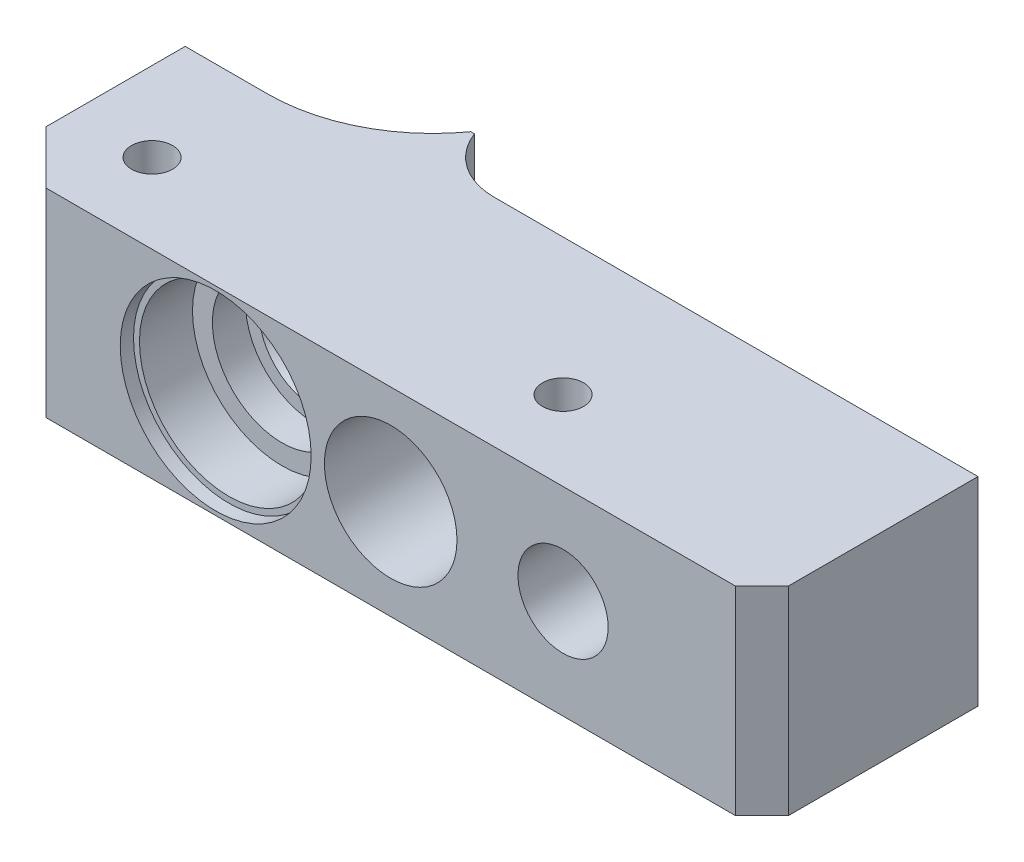
ISO-10303-21;
HEADER;
FILE_DESCRIPTION(('STEP AP214'),'2;1');
FILE_NAME('part.step','',(''),(''),'','','');
FILE_SCHEMA(('AUTOMOTIVE_DESIGN { 1 0 10303 214 1 1 1 1 }'));
ENDSEC;
DATA;
#1=APPLICATION_CONTEXT('core data for automotive mechanical design processes');
#2=APPLICATION_PROTOCOL_DEFINITION('international standard','automotive_design',2000,#1);
#3=PRODUCT_CONTEXT('',#1,'mechanical');
#4=PRODUCT('Part','Part','',(#3));
#5=PRODUCT_RELATED_PRODUCT_CATEGORY('part','',(#4));
#6=PRODUCT_DEFINITION_FORMATION('','',#4);
#7=PRODUCT_DEFINITION_CONTEXT('part definition',#1,'design');
#8=PRODUCT_DEFINITION('design','',#6,#7);
#9=PRODUCT_DEFINITION_SHAPE('','',#8);
#10=(LENGTH_UNIT() NAMED_UNIT(*) SI_UNIT(.MILLI.,.METRE.));
#11=(NAMED_UNIT(*) PLANE_ANGLE_UNIT() SI_UNIT($,.RADIAN.));
#12=(NAMED_UNIT(*) SI_UNIT($,.STERADIAN.) SOLID_ANGLE_UNIT());
#13=UNCERTAINTY_MEASURE_WITH_UNIT(LENGTH_MEASURE(1.E-05),#10,'distance_accuracy_value','');
#14=(GEOMETRIC_REPRESENTATION_CONTEXT(3) GLOBAL_UNCERTAINTY_ASSIGNED_CONTEXT((#13)) GLOBAL_UNIT_ASSIGNED_CONTEXT((#10,
#11,#12)) REPRESENTATION_CONTEXT('',''));
#15=CARTESIAN_POINT('',(0.,0.,0.));
#16=DIRECTION('',(0.,0.,1.));
#17=DIRECTION('',(1.,0.,0.));
#18=AXIS2_PLACEMENT_3D('',#15,#16,#17);
#19=CARTESIAN_POINT('',(-20.2,7.5,1.));
#20=DIRECTION('',(0.,0.,1.));
#21=DIRECTION('',(1.,0.,0.));
#22=AXIS2_PLACEMENT_3D('',#19,#20,#21);
#23=CYLINDRICAL_SURFACE('',#22,6.75);
#24=CARTESIAN_POINT('',(-20.2,7.5,1.));
#25=DIRECTION('',(0.,0.,1.));
#26=DIRECTION('',(1.,0.,0.));
#27=AXIS2_PLACEMENT_3D('',#24,#25,#26);
#28=CIRCLE('',#27,6.75);
#29=CARTESIAN_POINT('',(-13.45,7.5,1.));
#30=VERTEX_POINT('',#29);
#31=EDGE_CURVE('E292',#30,#30,#28,.T.);
#32=ORIENTED_EDGE('',*,*,#31,.F.);
#33=EDGE_LOOP('',(#32));
#34=FACE_BOUND('',#33,.T.);
#35=CARTESIAN_POINT('',(-20.2,7.5,5.));
#36=DIRECTION('',(0.,0.,1.));
#37=DIRECTION('',(1.,0.,0.));
#38=AXIS2_PLACEMENT_3D('',#35,#36,#37);
#39=CIRCLE('',#38,6.75);
#40=CARTESIAN_POINT('',(-13.45,7.5,5.));
#41=VERTEX_POINT('',#40);
#42=EDGE_CURVE('E91',#41,#41,#39,.F.);
#43=ORIENTED_EDGE('',*,*,#42,.F.);
#44=EDGE_LOOP('',(#43));
#45=FACE_BOUND('',#44,.T.);
#46=ADVANCED_FACE('F87',(#34,#45),#23,.F.);
#47=CARTESIAN_POINT('',(-20.2,7.5,-13.7));
#48=DIRECTION('',(0.,0.,1.));
#49=DIRECTION('',(1.,0.,0.));
#50=AXIS2_PLACEMENT_3D('',#47,#48,#49);
#51=CYLINDRICAL_SURFACE('',#50,2.);
#52=CARTESIAN_POINT('',(-20.2,7.5,-13.7));
#53=DIRECTION('',(0.,0.,1.));
#54=DIRECTION('',(1.,0.,0.));
#55=AXIS2_PLACEMENT_3D('',#52,#53,#54);
#56=CIRCLE('',#55,2.);
#57=CARTESIAN_POINT('',(-20.3785243670602,9.49201632783614,-13.7));
#58=VERTEX_POINT('',#57);
#59=CARTESIAN_POINT('',(-20.6530792848273,9.44800389159271,-13.7));
#60=VERTEX_POINT('',#59);
#61=EDGE_CURVE('E182',#58,#60,#56,.T.);
#62=ORIENTED_EDGE('',*,*,#61,.F.);
#63=CARTESIAN_POINT('',(-20.3785243670602,5.50798367216387,-13.7));
#64=CARTESIAN_POINT('',(-20.3562339665487,5.50598857259146,-13.639587014901));
#65=CARTESIAN_POINT('',(-20.332820429799,5.50426458071458,-13.5795852025534));
#66=CARTESIAN_POINT('',(-20.2837703921571,5.50160367173026,-13.4604677064122));
#67=CARTESIAN_POINT('',(-20.2581335023742,5.50066689262328,-13.4013521797699));
#68=CARTESIAN_POINT('',(-20.1777495380695,5.49940284539304,-13.2250553421974));
#69=CARTESIAN_POINT('',(-20.1196842480099,5.50063914822753,-13.1093442471664));
#70=CARTESIAN_POINT('',(-19.9942930428869,5.50959997922952,-12.881122720031));
#71=CARTESIAN_POINT('',(-19.9268467313035,5.517416903225,-12.7686815850578));
#72=CARTESIAN_POINT('',(-19.7842722756689,5.54234922035615,-12.5500856479677));
#73=CARTESIAN_POINT('',(-19.7091587023912,5.5594472334149,-12.4439195058642));
#74=CARTESIAN_POINT('',(-19.5478242950961,5.60733784578206,-12.2329254952434));
#75=CARTESIAN_POINT('',(-19.4612066626561,5.63889491447891,-12.1285653953106));
#76=CARTESIAN_POINT('',(-19.2841775081491,5.71936827884922,-11.9310437631113));
#77=CARTESIAN_POINT('',(-19.1937879504932,5.76819385257937,-11.8378270485851));
#78=CARTESIAN_POINT('',(-19.0275221034974,5.87716894917837,-11.6779868117538));
#79=CARTESIAN_POINT('',(-18.9515630719028,5.93439963428499,-11.6094800682182));
#80=CARTESIAN_POINT('',(-18.8038905224159,6.06453817201612,-11.4833177255646));
#81=CARTESIAN_POINT('',(-18.7321793637566,6.13745463418153,-11.4256681183861));
#82=CARTESIAN_POINT('',(-18.5971759432604,6.2991215773494,-11.3221041781254));
#83=CARTESIAN_POINT('',(-18.533943880843,6.38797578105395,-11.2762718241402));
#84=CARTESIAN_POINT('',(-18.4211708969462,6.57910369995304,-11.1974975938188));
#85=CARTESIAN_POINT('',(-18.3716216428973,6.68136919170932,-11.1645478671011));
#86=CARTESIAN_POINT('',(-18.2951951045445,6.88212552234289,-11.1149462119414));
#87=CARTESIAN_POINT('',(-18.2662407237146,6.97945302596012,-11.0967583169727));
#88=CARTESIAN_POINT('',(-18.2233633106406,7.1786423466987,-11.070108175831));
#89=CARTESIAN_POINT('',(-18.2094349793554,7.28050255212733,-11.0616425009814));
#90=CARTESIAN_POINT('',(-18.1977516669426,7.4797621506277,-11.0545332457909));
#91=CARTESIAN_POINT('',(-18.1991395728632,7.5770942402187,-11.0553691613861));
#92=CARTESIAN_POINT('',(-18.2159539785249,7.77006652583535,-11.0656240333755));
#93=CARTESIAN_POINT('',(-18.231378089697,7.86570700690253,-11.0750415294254));
#94=CARTESIAN_POINT('',(-18.2752893682829,8.05187797781074,-11.102452382365));
#95=CARTESIAN_POINT('',(-18.3036781490159,8.14244128722157,-11.1203811881517));
#96=CARTESIAN_POINT('',(-18.3720000744821,8.31681444948167,-11.1648797599333));
#97=CARTESIAN_POINT('',(-18.4119328643036,8.40062450985322,-11.1914492602797));
#98=CARTESIAN_POINT('',(-18.5023090772933,8.56138855470756,-11.2539178892886));
#99=CARTESIAN_POINT('',(-18.5529748600506,8.6381383604589,-11.2900191704708));
#100=CARTESIAN_POINT('',(-18.661578019386,8.78114389928999,-11.3709561552003));
#101=CARTESIAN_POINT('',(-18.7195177061625,8.84739628318991,-11.4157946361991));
#102=CARTESIAN_POINT('',(-18.8445106712633,8.97347389087995,-11.5173865968942));
#103=CARTESIAN_POINT('',(-18.9119221302739,9.03241481118798,-11.5747906576935));
#104=CARTESIAN_POINT('',(-19.048723322958,9.13768761590182,-11.6980226027821));
#105=CARTESIAN_POINT('',(-19.1181127596007,9.18402138260512,-11.7638492273893));
#106=CARTESIAN_POINT('',(-19.2393664401975,9.25523555219102,-11.8857726990475));
#107=CARTESIAN_POINT('',(-19.2913726528151,9.28259183412261,-11.9403204345301));
#108=CARTESIAN_POINT('',(-19.3941940858442,9.33136978632351,-12.0531066583528));
#109=CARTESIAN_POINT('',(-19.4450087663132,9.35278881194757,-12.1113467772528));
#110=CARTESIAN_POINT('',(-19.5450098829953,9.39046547930529,-12.2313563093779));
#111=CARTESIAN_POINT('',(-19.5941860958973,9.4066947512861,-12.2931430145462));
#112=CARTESIAN_POINT('',(-19.6901327643322,9.4345622819275,-12.4195633685843));
#113=CARTESIAN_POINT('',(-19.7369025024215,9.44619917827861,-12.4841978559255));
#114=CARTESIAN_POINT('',(-19.8437339278689,9.4690166988821,-12.6392830510628));
#115=CARTESIAN_POINT('',(-19.9026378990207,9.4785766056365,-12.7307708825984));
#116=CARTESIAN_POINT('',(-20.0147694975335,9.49220472594983,-12.9176083024134));
#117=CARTESIAN_POINT('',(-20.0679928293673,9.49626881045612,-13.0129607388667));
#118=CARTESIAN_POINT('',(-20.1676528276231,9.50035325572213,-13.205527814263));
#119=CARTESIAN_POINT('',(-20.2141737635466,9.50042920064257,-13.3026979598148));
#120=CARTESIAN_POINT('',(-20.3010163140429,9.49791187346795,-13.4995457648502));
#121=CARTESIAN_POINT('',(-20.3413482591663,9.49532310619865,-13.5992189154125));
#122=CARTESIAN_POINT('',(-20.3785243670602,9.49201632783614,-13.7));
#123=B_SPLINE_CURVE_WITH_KNOTS('',3,(#63,#64,#65,#66,#67,#68,#69,#70,#71,#72,#73,#74,#75,#76,
#77,#78,#79,#80,#81,#82,#83,#84,#85,#86,#87,#88,#89,#90,#91,#92,#93,#94,#95,#96,#97,#98,#99,
#100,#101,#102,#103,#104,#105,#106,#107,#108,#109,#110,#111,#112,#113,#114,#115,#116,#117,#118,
#119,#120,#121,#122),.UNSPECIFIED.,.F.,.F.,(4,2,2,2,2,2,2,2,2,2,2,2,2,2,2,2,2,2,2,2,2,2,2,2,2,2,
2,2,2,4),(0.,0.19325087262169,0.386535615563131,0.774446749085725,1.16789701765458,
1.56061302723225,1.97703870553847,2.39130837260285,2.74151364657041,3.09191163237225,
3.44467870601135,3.79723047507815,4.10511509605468,4.41289110384768,4.70353514672402,
4.99412973936987,5.28255479333315,5.57097098082777,5.86607863441976,6.16128025270456,
6.47915202401057,6.79697630973965,7.03719297993581,7.2775164790611,7.51913209610706,
7.7608193336606,8.0880890845316,8.41560457927831,8.73855414144733,9.0609586368926),.UNSPECIFIED.);
#124=CARTESIAN_POINT('',(-20.3785243670602,5.50798367216387,-13.7));
#125=VERTEX_POINT('',#124);
#126=EDGE_CURVE('E238',#125,#58,#123,.T.);
#127=ORIENTED_EDGE('',*,*,#126,.F.);
#128=CARTESIAN_POINT('',(-20.6530792848273,5.55199610840729,-13.7));
#129=VERTEX_POINT('',#128);
#130=EDGE_CURVE('E185',#129,#125,#56,.T.);
#131=ORIENTED_EDGE('',*,*,#130,.F.);
#132=CARTESIAN_POINT('',(-20.6530792848273,9.44800389159271,-13.7));
#133=CARTESIAN_POINT('',(-20.7164000191867,9.43324804122553,-13.6119577120493));
#134=CARTESIAN_POINT('',(-20.7806711469891,9.41506782841034,-13.5250648506704));
#135=CARTESIAN_POINT('',(-20.9106820421295,9.37074876727692,-13.3538974366582));
#136=CARTESIAN_POINT('',(-20.9764267488168,9.34457760805299,-13.2696350738356));
#137=CARTESIAN_POINT('',(-21.1093861216868,9.28282308822788,-13.1035769152212));
#138=CARTESIAN_POINT('',(-21.1766082326621,9.24710784059899,-13.0218351197566));
#139=CARTESIAN_POINT('',(-21.3103009544383,9.16534143549135,-12.8632723998238));
#140=CARTESIAN_POINT('',(-21.3767727308099,9.11930963350934,-12.7864426021788));
#141=CARTESIAN_POINT('',(-21.5118841753314,9.0122423403834,-12.6338806518019));
#142=CARTESIAN_POINT('',(-21.5803726863259,8.95041085402148,-12.558563569971));
#143=CARTESIAN_POINT('',(-21.7118784582735,8.81271846860391,-12.4171498895161));
#144=CARTESIAN_POINT('',(-21.7749195190487,8.73692365839863,-12.3510123271781));
#145=CARTESIAN_POINT('',(-21.8831228017168,8.58372581378089,-12.2396132233812));
#146=CARTESIAN_POINT('',(-21.9295396367906,8.50842267240349,-12.1927045058238));
#147=CARTESIAN_POINT('',(-22.0136480920226,8.34786952149448,-12.1087932851723));
#148=CARTESIAN_POINT('',(-22.0513360334003,8.26261534079265,-12.0717949577746));
#149=CARTESIAN_POINT('',(-22.1155241514763,8.08303127170204,-12.0093424472685));
#150=CARTESIAN_POINT('',(-22.1419270221322,7.98863073031735,-11.9839885346563));
#151=CARTESIAN_POINT('',(-22.1806767467483,7.79442721207272,-11.9469334753263));
#152=CARTESIAN_POINT('',(-22.1930391773032,7.69463035101243,-11.9352171985286));
#153=CARTESIAN_POINT('',(-22.2018168208554,7.5086973574321,-11.9268935493764));
#154=CARTESIAN_POINT('',(-22.2003323651162,7.42273960330086,-11.9282963382838));
#155=CARTESIAN_POINT('',(-22.1864649607388,7.25253422596337,-11.9414622468067));
#156=CARTESIAN_POINT('',(-22.1740844419989,7.16828622575527,-11.9532230565114));
#157=CARTESIAN_POINT('',(-22.1399889573009,7.0070691149161,-11.985859374708));
#158=CARTESIAN_POINT('',(-22.1186475713925,6.92994497668114,-12.0063705742561));
#159=CARTESIAN_POINT('',(-22.067996392882,6.78113008701647,-12.0555405761615));
#160=CARTESIAN_POINT('',(-22.0386843197539,6.70944089812082,-12.0842017104375));
#161=CARTESIAN_POINT('',(-21.9703376662027,6.56573522736917,-12.1518598008604));
#162=CARTESIAN_POINT('',(-21.9306261818938,6.49439488694925,-12.1916010750382));
#163=CARTESIAN_POINT('',(-21.8453560083942,6.36020439193547,-12.2782994061336));
#164=CARTESIAN_POINT('',(-21.7997967470596,6.29735506933577,-12.3252571691981));
#165=CARTESIAN_POINT('',(-21.6773667632478,6.14668700870405,-12.4537009298731));
#166=CARTESIAN_POINT('',(-21.5974631500624,6.06508358286807,-12.539599982416));
#167=CARTESIAN_POINT('',(-21.4325009317009,5.92106677497512,-12.7226054529218));
#168=CARTESIAN_POINT('',(-21.3474164566884,5.8587610989037,-12.8197707556892));
#169=CARTESIAN_POINT('',(-21.2103083947789,5.7728767639308,-12.9816337295265));
#170=CARTESIAN_POINT('',(-21.1586444684161,5.74376686272967,-13.0438101585901));
#171=CARTESIAN_POINT('',(-21.055378876319,5.69121991060417,-13.1706296957197));
#172=CARTESIAN_POINT('',(-21.0037772572893,5.66778583507374,-13.2352740770752));
#173=CARTESIAN_POINT('',(-20.9018032576657,5.62637717572571,-13.3657050942966));
#174=CARTESIAN_POINT('',(-20.851423697765,5.60833284207042,-13.4314643379647));
#175=CARTESIAN_POINT('',(-20.7515414201359,5.57684409957968,-13.5645829878331));
#176=CARTESIAN_POINT('',(-20.702037568728,5.5633932562505,-13.631940013162));
#177=CARTESIAN_POINT('',(-20.6530792848273,5.55199610840729,-13.7));
#178=B_SPLINE_CURVE_WITH_KNOTS('',3,(#132,#133,#134,#135,#136,#137,#138,#139,#140,#141,#142,
#143,#144,#145,#146,#147,#148,#149,#150,#151,#152,#153,#154,#155,#156,#157,#158,#159,#160,#161,
#162,#163,#164,#165,#166,#167,#168,#169,#170,#171,#172,#173,#174,#175,#176,#177),.UNSPECIFIED.,
.F.,.F.,(4,2,2,2,2,2,2,2,2,2,2,2,2,2,2,2,2,2,2,2,2,2,4),(0.,0.328408263740783,0.658162417241066,
0.99273279383596,1.3266806412183,1.68290430116758,2.03748334944445,2.33668537813836,
2.63601327660178,2.93787248081662,3.23939647149586,3.4960264747868,3.75259926228858,
3.99939747720413,4.24626637900199,4.51768041994918,4.78912103619932,5.21544627283941,
5.64410976624085,5.9016698409457,6.15936464354237,6.41356360679492,6.66740501710359),.UNSPECIFIED.);
#179=EDGE_CURVE('E178',#60,#129,#178,.T.);
#180=ORIENTED_EDGE('',*,*,#179,.F.);
#181=EDGE_LOOP('',(#62,#127,#131,#180));
#182=FACE_BOUND('',#181,.T.);
#183=CARTESIAN_POINT('',(-20.2,7.5,-9.));
#184=DIRECTION('',(0.,0.,1.));
#185=DIRECTION('',(1.,0.,0.));
#186=AXIS2_PLACEMENT_3D('',#183,#184,#185);
#187=CIRCLE('',#186,2.);
#188=CARTESIAN_POINT('',(-18.2,7.5,-9.));
#189=VERTEX_POINT('',#188);
#190=EDGE_CURVE('E251',#189,#189,#187,.F.);
#191=ORIENTED_EDGE('',*,*,#190,.F.);
#192=EDGE_LOOP('',(#191));
#193=FACE_BOUND('',#192,.T.);
#194=ADVANCED_FACE('F180',(#182,#193),#51,.F.);
#195=CARTESIAN_POINT('',(-20.3785243670602,73.44518799696,-13.7));
#196=DIRECTION('',(0.,0.,1.));
#197=DIRECTION('',(1.,0.,0.));
#198=AXIS2_PLACEMENT_3D('',#195,#196,#197);
#199=PLANE('',#198);
#200=DIRECTION('',(0.,-1.,0.));
#201=VECTOR('',#200,1.);
#202=CARTESIAN_POINT('',(-20.3785243670602,73.44518799696,-13.7));
#203=LINE('',#202,#201);
#204=CARTESIAN_POINT('',(-20.3785243670602,15.,-13.7));
#205=VERTEX_POINT('',#204);
#206=EDGE_CURVE('E199',#205,#58,#203,.T.);
#207=ORIENTED_EDGE('',*,*,#206,.T.);
#208=ORIENTED_EDGE('',*,*,#61,.T.);
#209=DIRECTION('',(0.,-1.,0.));
#210=VECTOR('',#209,1.);
#211=CARTESIAN_POINT('',(-20.6530792848273,73.44518799696,-13.7));
#212=LINE('',#211,#210);
#213=CARTESIAN_POINT('',(-20.6530792848273,15.,-13.7));
#214=VERTEX_POINT('',#213);
#215=EDGE_CURVE('E196',#214,#60,#212,.T.);
#216=ORIENTED_EDGE('',*,*,#215,.F.);
#217=DIRECTION('',(1.,0.,0.));
#218=VECTOR('',#217,1.);
#219=CARTESIAN_POINT('',(-20.3785243670602,15.,-13.7));
#220=LINE('',#219,#218);
#221=EDGE_CURVE('E456',#214,#205,#220,.T.);
#222=ORIENTED_EDGE('',*,*,#221,.T.);
#223=EDGE_LOOP('',(#207,#208,#216,#222));
#224=FACE_BOUND('',#223,.T.);
#225=ADVANCED_FACE('F194',(#224),#199,.F.);
#226=CARTESIAN_POINT('',(0.,15.,0.));
#227=DIRECTION('',(0.,-1.,0.));
#228=DIRECTION('',(0.,0.,-1.));
#229=AXIS2_PLACEMENT_3D('',#226,#227,#228);
#230=PLANE('',#229);
#231=CARTESIAN_POINT('',(0.,15.,0.));
#232=DIRECTION('',(0.,1.,0.));
#233=DIRECTION('',(0.,0.,1.));
#234=AXIS2_PLACEMENT_3D('',#231,#232,#233);
#235=CIRCLE('',#234,1.55);
#236=CARTESIAN_POINT('',(0.,15.,1.55));
#237=VERTEX_POINT('',#236);
#238=EDGE_CURVE('E224',#237,#237,#235,.T.);
#239=ORIENTED_EDGE('',*,*,#238,.F.);
#240=EDGE_LOOP('',(#239));
#241=FACE_BOUND('',#240,.T.);
#242=DIRECTION('',(1.,0.,0.));
#243=VECTOR('',#242,1.);
#244=CARTESIAN_POINT('',(-37.,15.,6.));
#245=LINE('',#244,#243);
#246=CARTESIAN_POINT('',(-33.,15.,6.));
#247=VERTEX_POINT('',#246);
#248=CARTESIAN_POINT('',(19.,15.,6.));
#249=VERTEX_POINT('',#248);
#250=EDGE_CURVE('E233',#247,#249,#245,.T.);
#251=ORIENTED_EDGE('',*,*,#250,.T.);
#252=DIRECTION('',(-0.707106781186549,0.,0.707106781186546));
#253=VECTOR('',#252,1.);
#254=CARTESIAN_POINT('',(21.,15.,4.00000000000001));
#255=LINE('',#254,#253);
#256=CARTESIAN_POINT('',(21.,15.,4.00000000000001));
#257=VERTEX_POINT('',#256);
#258=EDGE_CURVE('E381',#249,#257,#255,.F.);
#259=ORIENTED_EDGE('',*,*,#258,.T.);
#260=DIRECTION('',(0.,0.,-1.));
#261=VECTOR('',#260,1.);
#262=CARTESIAN_POINT('',(21.,15.,-6.5));
#263=LINE('',#262,#261);
#264=CARTESIAN_POINT('',(21.,15.,-10.3));
#265=VERTEX_POINT('',#264);
#266=EDGE_CURVE('E236',#257,#265,#263,.T.);
#267=ORIENTED_EDGE('',*,*,#266,.T.);
#268=DIRECTION('',(1.,0.,0.));
#269=VECTOR('',#268,1.);
#270=CARTESIAN_POINT('',(-15.5,15.,-10.3));
#271=LINE('',#270,#269);
#272=CARTESIAN_POINT('',(-15.5,15.,-10.3));
#273=VERTEX_POINT('',#272);
#274=EDGE_CURVE('E212',#273,#265,#271,.T.);
#275=ORIENTED_EDGE('',*,*,#274,.F.);
#276=CARTESIAN_POINT('',(-15.5,15.,-15.5));
#277=DIRECTION('',(0.,-1.,0.));
#278=DIRECTION('',(0.,0.,-1.));
#279=AXIS2_PLACEMENT_3D('',#276,#277,#278);
#280=CIRCLE('',#279,5.20000000000001);
#281=EDGE_CURVE('E223',#205,#273,#280,.F.);
#282=ORIENTED_EDGE('',*,*,#281,.F.);
#283=ORIENTED_EDGE('',*,*,#221,.F.);
#284=CARTESIAN_POINT('',(-30.8,15.,-21.));
#285=DIRECTION('',(0.,-1.,0.));
#286=DIRECTION('',(0.,0.,-1.));
#287=AXIS2_PLACEMENT_3D('',#284,#285,#286);
#288=CIRCLE('',#287,12.5);
#289=CARTESIAN_POINT('',(-30.8,15.,-8.5));
#290=VERTEX_POINT('',#289);
#291=EDGE_CURVE('E203',#290,#214,#288,.F.);
#292=ORIENTED_EDGE('',*,*,#291,.F.);
#293=DIRECTION('',(1.,0.,0.));
#294=VECTOR('',#293,1.);
#295=CARTESIAN_POINT('',(-30.8,15.,-8.5));
#296=LINE('',#295,#294);
#297=CARTESIAN_POINT('',(-37.,15.,-8.5));
#298=VERTEX_POINT('',#297);
#299=EDGE_CURVE('E215',#298,#290,#296,.T.);
#300=ORIENTED_EDGE('',*,*,#299,.F.);
#301=DIRECTION('',(0.,0.,1.));
#302=VECTOR('',#301,1.);
#303=CARTESIAN_POINT('',(-37.,15.,6.));
#304=LINE('',#303,#302);
#305=CARTESIAN_POINT('',(-37.,15.,1.99999999999998));
#306=VERTEX_POINT('',#305);
#307=EDGE_CURVE('E230',#298,#306,#304,.T.);
#308=ORIENTED_EDGE('',*,*,#307,.T.);
#309=DIRECTION('',(-0.707106781186546,0.,-0.707106781186549));
#310=VECTOR('',#309,1.);
#311=CARTESIAN_POINT('',(-33.,15.,6.));
#312=LINE('',#311,#310);
#313=EDGE_CURVE('E371',#306,#247,#312,.F.);
#314=ORIENTED_EDGE('',*,*,#313,.T.);
#315=EDGE_LOOP('',(#251,#259,#267,#275,#282,#283,#292,#300,#308,#314));
#316=FACE_BOUND('',#315,.T.);
#317=CARTESIAN_POINT('',(-31.,15.,0.));
#318=DIRECTION('',(0.,1.,0.));
#319=DIRECTION('',(0.,0.,1.));
#320=AXIS2_PLACEMENT_3D('',#317,#318,#319);
#321=CIRCLE('',#320,1.55);
#322=CARTESIAN_POINT('',(-31.,15.,1.55));
#323=VERTEX_POINT('',#322);
#324=EDGE_CURVE('E216',#323,#323,#321,.T.);
#325=ORIENTED_EDGE('',*,*,#324,.F.);
#326=EDGE_LOOP('',(#325));
#327=FACE_BOUND('',#326,.T.);
#328=ADVANCED_FACE('F284',(#241,#316,#327),#230,.F.);
#329=CARTESIAN_POINT('',(0.,0.,0.));
#330=DIRECTION('',(0.,-1.,0.));
#331=DIRECTION('',(0.,0.,-1.));
#332=AXIS2_PLACEMENT_3D('',#329,#330,#331);
#333=PLANE('',#332);
#334=CARTESIAN_POINT('',(0.,0.,0.));
#335=DIRECTION('',(0.,1.,0.));
#336=DIRECTION('',(0.,0.,1.));
#337=AXIS2_PLACEMENT_3D('',#334,#335,#336);
#338=CIRCLE('',#337,1.55);
#339=CARTESIAN_POINT('',(0.,0.,1.55));
#340=VERTEX_POINT('',#339);
#341=EDGE_CURVE('E219',#340,#340,#338,.T.);
#342=ORIENTED_EDGE('',*,*,#341,.T.);
#343=EDGE_LOOP('',(#342));
#344=FACE_BOUND('',#343,.T.);
#345=DIRECTION('',(0.,0.,-1.));
#346=VECTOR('',#345,1.);
#347=CARTESIAN_POINT('',(21.,0.,-6.5));
#348=LINE('',#347,#346);
#349=CARTESIAN_POINT('',(21.,0.,4.00000000000001));
#350=VERTEX_POINT('',#349);
#351=CARTESIAN_POINT('',(21.,0.,-10.3));
#352=VERTEX_POINT('',#351);
#353=EDGE_CURVE('E234',#350,#352,#348,.T.);
#354=ORIENTED_EDGE('',*,*,#353,.F.);
#355=DIRECTION('',(0.707106781186549,0.,-0.707106781186546));
#356=VECTOR('',#355,1.);
#357=CARTESIAN_POINT('',(12.5,0.,12.5));
#358=LINE('',#357,#356);
#359=CARTESIAN_POINT('',(19.,0.,6.));
#360=VERTEX_POINT('',#359);
#361=EDGE_CURVE('E111',#350,#360,#358,.F.);
#362=ORIENTED_EDGE('',*,*,#361,.T.);
#363=DIRECTION('',(1.,0.,0.));
#364=VECTOR('',#363,1.);
#365=CARTESIAN_POINT('',(-37.,0.,6.));
#366=LINE('',#365,#364);
#367=CARTESIAN_POINT('',(-33.,0.,6.));
#368=VERTEX_POINT('',#367);
#369=EDGE_CURVE('E241',#368,#360,#366,.T.);
#370=ORIENTED_EDGE('',*,*,#369,.F.);
#371=DIRECTION('',(0.707106781186546,0.,0.707106781186549));
#372=VECTOR('',#371,1.);
#373=CARTESIAN_POINT('',(-19.5000000000001,0.,19.5));
#374=LINE('',#373,#372);
#375=CARTESIAN_POINT('',(-37.,0.,1.99999999999998));
#376=VERTEX_POINT('',#375);
#377=EDGE_CURVE('E362',#368,#376,#374,.F.);
#378=ORIENTED_EDGE('',*,*,#377,.T.);
#379=DIRECTION('',(0.,0.,1.));
#380=VECTOR('',#379,1.);
#381=CARTESIAN_POINT('',(-37.,0.,6.));
#382=LINE('',#381,#380);
#383=CARTESIAN_POINT('',(-37.,0.,-8.5));
#384=VERTEX_POINT('',#383);
#385=EDGE_CURVE('E227',#384,#376,#382,.T.);
#386=ORIENTED_EDGE('',*,*,#385,.F.);
#387=DIRECTION('',(-1.,0.,0.));
#388=VECTOR('',#387,1.);
#389=CARTESIAN_POINT('',(-30.8,0.,-8.5));
#390=LINE('',#389,#388);
#391=CARTESIAN_POINT('',(-30.8,0.,-8.5));
#392=VERTEX_POINT('',#391);
#393=EDGE_CURVE('E343',#392,#384,#390,.T.);
#394=ORIENTED_EDGE('',*,*,#393,.F.);
#395=CARTESIAN_POINT('',(-30.8,0.,-21.));
#396=DIRECTION('',(0.,-1.,0.));
#397=DIRECTION('',(0.,0.,-1.));
#398=AXIS2_PLACEMENT_3D('',#395,#396,#397);
#399=CIRCLE('',#398,12.5);
#400=CARTESIAN_POINT('',(-20.6530792848273,0.,-13.7));
#401=VERTEX_POINT('',#400);
#402=EDGE_CURVE('E336',#401,#392,#399,.T.);
#403=ORIENTED_EDGE('',*,*,#402,.F.);
#404=DIRECTION('',(-1.,0.,0.));
#405=VECTOR('',#404,1.);
#406=CARTESIAN_POINT('',(-20.3785243670602,0.,-13.7));
#407=LINE('',#406,#405);
#408=CARTESIAN_POINT('',(-20.3785243670602,0.,-13.7));
#409=VERTEX_POINT('',#408);
#410=EDGE_CURVE('E334',#409,#401,#407,.T.);
#411=ORIENTED_EDGE('',*,*,#410,.F.);
#412=CARTESIAN_POINT('',(-15.5,0.,-15.5));
#413=DIRECTION('',(0.,-1.,0.));
#414=DIRECTION('',(0.,0.,-1.));
#415=AXIS2_PLACEMENT_3D('',#412,#413,#414);
#416=CIRCLE('',#415,5.20000000000001);
#417=CARTESIAN_POINT('',(-15.5,0.,-10.3));
#418=VERTEX_POINT('',#417);
#419=EDGE_CURVE('E189',#418,#409,#416,.T.);
#420=ORIENTED_EDGE('',*,*,#419,.F.);
#421=DIRECTION('',(-1.,0.,0.));
#422=VECTOR('',#421,1.);
#423=CARTESIAN_POINT('',(-15.5,0.,-10.3));
#424=LINE('',#423,#422);
#425=EDGE_CURVE('E346',#352,#418,#424,.T.);
#426=ORIENTED_EDGE('',*,*,#425,.F.);
#427=EDGE_LOOP('',(#354,#362,#370,#378,#386,#394,#403,#411,#420,#426));
#428=FACE_BOUND('',#427,.T.);
#429=CARTESIAN_POINT('',(-31.,0.,0.));
#430=DIRECTION('',(0.,1.,0.));
#431=DIRECTION('',(0.,0.,1.));
#432=AXIS2_PLACEMENT_3D('',#429,#430,#431);
#433=CIRCLE('',#432,1.55);
#434=CARTESIAN_POINT('',(-31.,0.,1.55));
#435=VERTEX_POINT('',#434);
#436=EDGE_CURVE('E220',#435,#435,#433,.T.);
#437=ORIENTED_EDGE('',*,*,#436,.T.);
#438=EDGE_LOOP('',(#437));
#439=FACE_BOUND('',#438,.T.);
#440=ADVANCED_FACE('F360',(#344,#428,#439),#333,.T.);
#441=CARTESIAN_POINT('',(-37.,15.,6.));
#442=DIRECTION('',(1.,0.,0.));
#443=DIRECTION('',(0.,0.,-1.));
#444=AXIS2_PLACEMENT_3D('',#441,#442,#443);
#445=PLANE('',#444);
#446=ORIENTED_EDGE('',*,*,#385,.T.);
#447=DIRECTION('',(0.,1.,0.));
#448=VECTOR('',#447,1.);
#449=CARTESIAN_POINT('',(-37.,15.,1.99999999999998));
#450=LINE('',#449,#448);
#451=EDGE_CURVE('E365',#376,#306,#450,.T.);
#452=ORIENTED_EDGE('',*,*,#451,.T.);
#453=ORIENTED_EDGE('',*,*,#307,.F.);
#454=DIRECTION('',(0.,-1.,0.));
#455=VECTOR('',#454,1.);
#456=CARTESIAN_POINT('',(-37.,73.44518799696,-8.5));
#457=LINE('',#456,#455);
#458=EDGE_CURVE('E351',#298,#384,#457,.T.);
#459=ORIENTED_EDGE('',*,*,#458,.T.);
#460=EDGE_LOOP('',(#446,#452,#453,#459));
#461=FACE_BOUND('',#460,.T.);
#462=ADVANCED_FACE('F364',(#461),#445,.F.);
#463=CARTESIAN_POINT('',(-37.,15.,6.));
#464=DIRECTION('',(0.,0.,-1.));
#465=DIRECTION('',(-1.,0.,0.));
#466=AXIS2_PLACEMENT_3D('',#463,#464,#465);
#467=PLANE('',#466);
#468=CARTESIAN_POINT('',(-20.2,7.5,6.));
#469=DIRECTION('',(0.,0.,1.));
#470=DIRECTION('',(1.,0.,0.));
#471=AXIS2_PLACEMENT_3D('',#468,#469,#470);
#472=CIRCLE('',#471,7.2);
#473=CARTESIAN_POINT('',(-13.,7.5,6.));
#474=VERTEX_POINT('',#473);
#475=EDGE_CURVE('E302',#474,#474,#472,.T.);
#476=ORIENTED_EDGE('',*,*,#475,.F.);
#477=EDGE_LOOP('',(#476));
#478=FACE_BOUND('',#477,.T.);
#479=CARTESIAN_POINT('',(-7.,7.5,6.));
#480=DIRECTION('',(0.,0.,1.));
#481=DIRECTION('',(1.,0.,0.));
#482=AXIS2_PLACEMENT_3D('',#479,#480,#481);
#483=CIRCLE('',#482,5.);
#484=CARTESIAN_POINT('',(-2.,7.5,6.));
#485=VERTEX_POINT('',#484);
#486=EDGE_CURVE('E296',#485,#485,#483,.T.);
#487=ORIENTED_EDGE('',*,*,#486,.F.);
#488=EDGE_LOOP('',(#487));
#489=FACE_BOUND('',#488,.T.);
#490=CARTESIAN_POINT('',(6.,7.5,6.));
#491=DIRECTION('',(0.,0.,1.));
#492=DIRECTION('',(1.,0.,0.));
#493=AXIS2_PLACEMENT_3D('',#490,#491,#492);
#494=CIRCLE('',#493,3.39999999999999);
#495=CARTESIAN_POINT('',(9.39999999999999,7.5,6.));
#496=VERTEX_POINT('',#495);
#497=EDGE_CURVE('E309',#496,#496,#494,.T.);
#498=ORIENTED_EDGE('',*,*,#497,.F.);
#499=EDGE_LOOP('',(#498));
#500=FACE_BOUND('',#499,.T.);
#501=ORIENTED_EDGE('',*,*,#369,.T.);
#502=DIRECTION('',(0.,1.,0.));
#503=VECTOR('',#502,1.);
#504=CARTESIAN_POINT('',(19.,15.,6.));
#505=LINE('',#504,#503);
#506=EDGE_CURVE('E103',#360,#249,#505,.T.);
#507=ORIENTED_EDGE('',*,*,#506,.T.);
#508=ORIENTED_EDGE('',*,*,#250,.F.);
#509=DIRECTION('',(0.,-1.,0.));
#510=VECTOR('',#509,1.);
#511=CARTESIAN_POINT('',(-33.,15.,6.));
#512=LINE('',#511,#510);
#513=EDGE_CURVE('E250',#247,#368,#512,.T.);
#514=ORIENTED_EDGE('',*,*,#513,.T.);
#515=EDGE_LOOP('',(#501,#507,#508,#514));
#516=FACE_BOUND('',#515,.T.);
#517=ADVANCED_FACE('F439',(#478,#489,#500,#516),#467,.F.);
#518=CARTESIAN_POINT('',(21.,15.,-6.5));
#519=DIRECTION('',(-1.,0.,0.));
#520=DIRECTION('',(0.,0.,1.));
#521=AXIS2_PLACEMENT_3D('',#518,#519,#520);
#522=PLANE('',#521);
#523=ORIENTED_EDGE('',*,*,#266,.F.);
#524=DIRECTION('',(0.,-1.,0.));
#525=VECTOR('',#524,1.);
#526=CARTESIAN_POINT('',(21.,15.,4.00000000000001));
#527=LINE('',#526,#525);
#528=EDGE_CURVE('E373',#257,#350,#527,.T.);
#529=ORIENTED_EDGE('',*,*,#528,.T.);
#530=ORIENTED_EDGE('',*,*,#353,.T.);
#531=DIRECTION('',(0.,-1.,0.));
#532=VECTOR('',#531,1.);
#533=CARTESIAN_POINT('',(21.,73.44518799696,-10.3));
#534=LINE('',#533,#532);
#535=EDGE_CURVE('E349',#265,#352,#534,.T.);
#536=ORIENTED_EDGE('',*,*,#535,.F.);
#537=EDGE_LOOP('',(#523,#529,#530,#536));
#538=FACE_BOUND('',#537,.T.);
#539=ADVANCED_FACE('F442',(#538),#522,.F.);
#540=CARTESIAN_POINT('',(0.,15.,0.));
#541=DIRECTION('',(0.,-1.,0.));
#542=DIRECTION('',(0.,0.,-1.));
#543=AXIS2_PLACEMENT_3D('',#540,#541,#542);
#544=CYLINDRICAL_SURFACE('',#543,1.55);
#545=ORIENTED_EDGE('',*,*,#238,.T.);
#546=EDGE_LOOP('',(#545));
#547=FACE_BOUND('',#546,.T.);
#548=ORIENTED_EDGE('',*,*,#341,.F.);
#549=EDGE_LOOP('',(#548));
#550=FACE_BOUND('',#549,.T.);
#551=ADVANCED_FACE('F464',(#547,#550),#544,.F.);
#552=CARTESIAN_POINT('',(-31.,15.,0.));
#553=DIRECTION('',(0.,-1.,0.));
#554=DIRECTION('',(0.,0.,-1.));
#555=AXIS2_PLACEMENT_3D('',#552,#553,#554);
#556=CYLINDRICAL_SURFACE('',#555,1.55);
#557=ORIENTED_EDGE('',*,*,#324,.T.);
#558=EDGE_LOOP('',(#557));
#559=FACE_BOUND('',#558,.T.);
#560=ORIENTED_EDGE('',*,*,#436,.F.);
#561=EDGE_LOOP('',(#560));
#562=FACE_BOUND('',#561,.T.);
#563=ADVANCED_FACE('F458',(#559,#562),#556,.F.);
#564=CARTESIAN_POINT('',(-15.5,73.44518799696,-10.3));
#565=DIRECTION('',(0.,0.,1.));
#566=DIRECTION('',(1.,0.,0.));
#567=AXIS2_PLACEMENT_3D('',#564,#565,#566);
#568=PLANE('',#567);
#569=CARTESIAN_POINT('',(-7.,7.5,-10.3));
#570=DIRECTION('',(0.,0.,1.));
#571=DIRECTION('',(1.,0.,0.));
#572=AXIS2_PLACEMENT_3D('',#569,#570,#571);
#573=CIRCLE('',#572,5.);
#574=CARTESIAN_POINT('',(-2.,7.5,-10.3));
#575=VERTEX_POINT('',#574);
#576=EDGE_CURVE('E299',#575,#575,#573,.T.);
#577=ORIENTED_EDGE('',*,*,#576,.T.);
#578=EDGE_LOOP('',(#577));
#579=FACE_BOUND('',#578,.T.);
#580=CARTESIAN_POINT('',(6.,7.5,-10.3));
#581=DIRECTION('',(0.,0.,1.));
#582=DIRECTION('',(1.,0.,0.));
#583=AXIS2_PLACEMENT_3D('',#580,#581,#582);
#584=CIRCLE('',#583,3.39999999999999);
#585=CARTESIAN_POINT('',(9.39999999999999,7.5,-10.3));
#586=VERTEX_POINT('',#585);
#587=EDGE_CURVE('E312',#586,#586,#584,.T.);
#588=ORIENTED_EDGE('',*,*,#587,.T.);
#589=EDGE_LOOP('',(#588));
#590=FACE_BOUND('',#589,.T.);
#591=DIRECTION('',(0.,-1.,0.));
#592=VECTOR('',#591,1.);
#593=CARTESIAN_POINT('',(-15.5,73.44518799696,-10.3));
#594=LINE('',#593,#592);
#595=EDGE_CURVE('E331',#273,#418,#594,.T.);
#596=ORIENTED_EDGE('',*,*,#595,.F.);
#597=ORIENTED_EDGE('',*,*,#274,.T.);
#598=ORIENTED_EDGE('',*,*,#535,.T.);
#599=ORIENTED_EDGE('',*,*,#425,.T.);
#600=EDGE_LOOP('',(#596,#597,#598,#599));
#601=FACE_BOUND('',#600,.T.);
#602=ADVANCED_FACE('F262',(#579,#590,#601),#568,.F.);
#603=CARTESIAN_POINT('',(-30.8,73.44518799696,-8.5));
#604=DIRECTION('',(0.,0.,1.));
#605=DIRECTION('',(1.,0.,0.));
#606=AXIS2_PLACEMENT_3D('',#603,#604,#605);
#607=PLANE('',#606);
#608=ORIENTED_EDGE('',*,*,#458,.F.);
#609=ORIENTED_EDGE('',*,*,#299,.T.);
#610=DIRECTION('',(0.,-1.,0.));
#611=VECTOR('',#610,1.);
#612=CARTESIAN_POINT('',(-30.8,73.44518799696,-8.5));
#613=LINE('',#612,#611);
#614=EDGE_CURVE('E208',#290,#392,#613,.T.);
#615=ORIENTED_EDGE('',*,*,#614,.T.);
#616=ORIENTED_EDGE('',*,*,#393,.T.);
#617=EDGE_LOOP('',(#608,#609,#615,#616));
#618=FACE_BOUND('',#617,.T.);
#619=ADVANCED_FACE('F275',(#618),#607,.F.);
#620=CARTESIAN_POINT('',(-30.8,73.44518799696,-21.));
#621=DIRECTION('',(0.,-1.,0.));
#622=DIRECTION('',(0.,0.,-1.));
#623=AXIS2_PLACEMENT_3D('',#620,#621,#622);
#624=CYLINDRICAL_SURFACE('',#623,12.5);
#625=ORIENTED_EDGE('',*,*,#215,.T.);
#626=ORIENTED_EDGE('',*,*,#179,.T.);
#627=EDGE_CURVE('E205',#129,#401,#212,.T.);
#628=ORIENTED_EDGE('',*,*,#627,.T.);
#629=ORIENTED_EDGE('',*,*,#402,.T.);
#630=ORIENTED_EDGE('',*,*,#614,.F.);
#631=ORIENTED_EDGE('',*,*,#291,.T.);
#632=EDGE_LOOP('',(#625,#626,#628,#629,#630,#631));
#633=FACE_BOUND('',#632,.T.);
#634=ADVANCED_FACE('F201',(#633),#624,.F.);
#635=ORIENTED_EDGE('',*,*,#627,.F.);
#636=ORIENTED_EDGE('',*,*,#130,.T.);
#637=EDGE_CURVE('E204',#125,#409,#203,.T.);
#638=ORIENTED_EDGE('',*,*,#637,.T.);
#639=ORIENTED_EDGE('',*,*,#410,.T.);
#640=EDGE_LOOP('',(#635,#636,#638,#639));
#641=FACE_BOUND('',#640,.T.);
#642=ADVANCED_FACE('F274',(#641),#199,.F.);
#643=CARTESIAN_POINT('',(-15.5,73.44518799696,-15.5));
#644=DIRECTION('',(0.,-1.,0.));
#645=DIRECTION('',(0.,0.,-1.));
#646=AXIS2_PLACEMENT_3D('',#643,#644,#645);
#647=CYLINDRICAL_SURFACE('',#646,5.20000000000001);
#648=ORIENTED_EDGE('',*,*,#637,.F.);
#649=ORIENTED_EDGE('',*,*,#126,.T.);
#650=ORIENTED_EDGE('',*,*,#206,.F.);
#651=ORIENTED_EDGE('',*,*,#281,.T.);
#652=ORIENTED_EDGE('',*,*,#595,.T.);
#653=ORIENTED_EDGE('',*,*,#419,.T.);
#654=EDGE_LOOP('',(#648,#649,#650,#651,#652,#653));
#655=FACE_BOUND('',#654,.T.);
#656=ADVANCED_FACE('F253',(#655),#647,.F.);
#657=CARTESIAN_POINT('',(-20.2,7.5,1.));
#658=DIRECTION('',(0.,0.,1.));
#659=DIRECTION('',(1.,0.,0.));
#660=AXIS2_PLACEMENT_3D('',#657,#658,#659);
#661=PLANE('',#660);
#662=CARTESIAN_POINT('',(-20.2,7.5,1.));
#663=DIRECTION('',(0.,0.,1.));
#664=DIRECTION('',(1.,0.,0.));
#665=AXIS2_PLACEMENT_3D('',#662,#663,#664);
#666=CIRCLE('',#665,5.25);
#667=CARTESIAN_POINT('',(-14.95,7.5,1.));
#668=VERTEX_POINT('',#667);
#669=EDGE_CURVE('E321',#668,#668,#666,.T.);
#670=ORIENTED_EDGE('',*,*,#669,.F.);
#671=EDGE_LOOP('',(#670));
#672=FACE_BOUND('',#671,.T.);
#673=ORIENTED_EDGE('',*,*,#31,.T.);
#674=EDGE_LOOP('',(#673));
#675=FACE_BOUND('',#674,.T.);
#676=ADVANCED_FACE('F281',(#672,#675),#661,.T.);
#677=CARTESIAN_POINT('',(-20.2,7.5,-1.5));
#678=DIRECTION('',(0.,0.,1.));
#679=DIRECTION('',(1.,0.,0.));
#680=AXIS2_PLACEMENT_3D('',#677,#678,#679);
#681=PLANE('',#680);
#682=CARTESIAN_POINT('',(-20.2,7.5,-1.5));
#683=DIRECTION('',(0.,0.,1.));
#684=DIRECTION('',(1.,0.,0.));
#685=AXIS2_PLACEMENT_3D('',#682,#683,#684);
#686=CIRCLE('',#685,4.25000000000001);
#687=CARTESIAN_POINT('',(-15.95,7.5,-1.5));
#688=VERTEX_POINT('',#687);
#689=EDGE_CURVE('E14',#688,#688,#686,.F.);
#690=ORIENTED_EDGE('',*,*,#689,.T.);
#691=EDGE_LOOP('',(#690));
#692=FACE_BOUND('',#691,.T.);
#693=CARTESIAN_POINT('',(-20.2,7.5,-1.5));
#694=DIRECTION('',(0.,0.,1.));
#695=DIRECTION('',(1.,0.,0.));
#696=AXIS2_PLACEMENT_3D('',#693,#694,#695);
#697=CIRCLE('',#696,5.25);
#698=CARTESIAN_POINT('',(-14.95,7.5,-1.5));
#699=VERTEX_POINT('',#698);
#700=EDGE_CURVE('E318',#699,#699,#697,.T.);
#701=ORIENTED_EDGE('',*,*,#700,.T.);
#702=EDGE_LOOP('',(#701));
#703=FACE_BOUND('',#702,.T.);
#704=ADVANCED_FACE('F406',(#692,#703),#681,.T.);
#705=CARTESIAN_POINT('',(-20.2,7.5,-1.5));
#706=DIRECTION('',(0.,0.,1.));
#707=DIRECTION('',(1.,0.,0.));
#708=AXIS2_PLACEMENT_3D('',#705,#706,#707);
#709=CYLINDRICAL_SURFACE('',#708,5.25);
#710=ORIENTED_EDGE('',*,*,#700,.F.);
#711=EDGE_LOOP('',(#710));
#712=FACE_BOUND('',#711,.T.);
#713=ORIENTED_EDGE('',*,*,#669,.T.);
#714=EDGE_LOOP('',(#713));
#715=FACE_BOUND('',#714,.T.);
#716=ADVANCED_FACE('F409',(#712,#715),#709,.F.);
#717=CARTESIAN_POINT('',(-20.2,7.5,-9.));
#718=DIRECTION('',(0.,0.,1.));
#719=DIRECTION('',(1.,0.,0.));
#720=AXIS2_PLACEMENT_3D('',#717,#718,#719);
#721=PLANE('',#720);
#722=CARTESIAN_POINT('',(-20.2,7.5,-9.));
#723=DIRECTION('',(0.,0.,1.));
#724=DIRECTION('',(1.,0.,0.));
#725=AXIS2_PLACEMENT_3D('',#722,#723,#724);
#726=CIRCLE('',#725,3.25);
#727=CARTESIAN_POINT('',(-16.95,7.5,-9.));
#728=VERTEX_POINT('',#727);
#729=EDGE_CURVE('E315',#728,#728,#726,.T.);
#730=ORIENTED_EDGE('',*,*,#729,.T.);
#731=EDGE_LOOP('',(#730));
#732=FACE_BOUND('',#731,.T.);
#733=ORIENTED_EDGE('',*,*,#190,.T.);
#734=EDGE_LOOP('',(#733));
#735=FACE_BOUND('',#734,.T.);
#736=ADVANCED_FACE('F415',(#732,#735),#721,.T.);
#737=CARTESIAN_POINT('',(-20.2,7.5,-9.));
#738=DIRECTION('',(0.,0.,1.));
#739=DIRECTION('',(1.,0.,0.));
#740=AXIS2_PLACEMENT_3D('',#737,#738,#739);
#741=CYLINDRICAL_SURFACE('',#740,3.25);
#742=CARTESIAN_POINT('',(-20.2,7.5,-3.23205080756889));
#743=DIRECTION('',(0.,0.,1.));
#744=DIRECTION('',(1.,0.,0.));
#745=AXIS2_PLACEMENT_3D('',#742,#743,#744);
#746=CIRCLE('',#745,3.25);
#747=CARTESIAN_POINT('',(-16.95,7.5,-3.23205080756889));
#748=VERTEX_POINT('',#747);
#749=EDGE_CURVE('E96',#748,#748,#746,.T.);
#750=ORIENTED_EDGE('',*,*,#749,.T.);
#751=EDGE_LOOP('',(#750));
#752=FACE_BOUND('',#751,.T.);
#753=ORIENTED_EDGE('',*,*,#729,.F.);
#754=EDGE_LOOP('',(#753));
#755=FACE_BOUND('',#754,.T.);
#756=ADVANCED_FACE('F388',(#752,#755),#741,.F.);
#757=CARTESIAN_POINT('',(6.,7.5,6.));
#758=DIRECTION('',(0.,0.,1.));
#759=DIRECTION('',(1.,0.,0.));
#760=AXIS2_PLACEMENT_3D('',#757,#758,#759);
#761=CYLINDRICAL_SURFACE('',#760,3.39999999999999);
#762=ORIENTED_EDGE('',*,*,#497,.T.);
#763=EDGE_LOOP('',(#762));
#764=FACE_BOUND('',#763,.T.);
#765=ORIENTED_EDGE('',*,*,#587,.F.);
#766=EDGE_LOOP('',(#765));
#767=FACE_BOUND('',#766,.T.);
#768=ADVANCED_FACE('F425',(#764,#767),#761,.F.);
#769=CARTESIAN_POINT('',(-33.,15.,6.));
#770=DIRECTION('',(0.707106781186549,0.,-0.707106781186546));
#771=DIRECTION('',(0.,-1.,0.));
#772=AXIS2_PLACEMENT_3D('',#769,#770,#771);
#773=PLANE('',#772);
#774=ORIENTED_EDGE('',*,*,#313,.F.);
#775=ORIENTED_EDGE('',*,*,#451,.F.);
#776=ORIENTED_EDGE('',*,*,#377,.F.);
#777=ORIENTED_EDGE('',*,*,#513,.F.);
#778=EDGE_LOOP('',(#774,#775,#776,#777));
#779=FACE_BOUND('',#778,.T.);
#780=ADVANCED_FACE('F368',(#779),#773,.F.);
#781=CARTESIAN_POINT('',(21.,15.,4.00000000000001));
#782=DIRECTION('',(-0.707106781186546,0.,-0.707106781186549));
#783=DIRECTION('',(0.,-1.,0.));
#784=AXIS2_PLACEMENT_3D('',#781,#782,#783);
#785=PLANE('',#784);
#786=ORIENTED_EDGE('',*,*,#258,.F.);
#787=ORIENTED_EDGE('',*,*,#506,.F.);
#788=ORIENTED_EDGE('',*,*,#361,.F.);
#789=ORIENTED_EDGE('',*,*,#528,.F.);
#790=EDGE_LOOP('',(#786,#787,#788,#789));
#791=FACE_BOUND('',#790,.T.);
#792=ADVANCED_FACE('F401',(#791),#785,.F.);
#793=CARTESIAN_POINT('',(-7.,7.5,-13.7));
#794=DIRECTION('',(0.,0.,1.));
#795=DIRECTION('',(1.,0.,0.));
#796=AXIS2_PLACEMENT_3D('',#793,#794,#795);
#797=CYLINDRICAL_SURFACE('',#796,5.);
#798=ORIENTED_EDGE('',*,*,#486,.T.);
#799=EDGE_LOOP('',(#798));
#800=FACE_BOUND('',#799,.T.);
#801=ORIENTED_EDGE('',*,*,#576,.F.);
#802=EDGE_LOOP('',(#801));
#803=FACE_BOUND('',#802,.T.);
#804=ADVANCED_FACE('F393',(#800,#803),#797,.F.);
#805=CARTESIAN_POINT('',(-20.2,7.5,-3.23205080756889));
#806=DIRECTION('',(0.,0.,1.));
#807=DIRECTION('',(1.,0.,0.));
#808=AXIS2_PLACEMENT_3D('',#805,#806,#807);
#809=CONICAL_SURFACE('',#808,3.25,0.5235987755983);
#810=ORIENTED_EDGE('',*,*,#689,.F.);
#811=EDGE_LOOP('',(#810));
#812=FACE_BOUND('',#811,.T.);
#813=ORIENTED_EDGE('',*,*,#749,.F.);
#814=EDGE_LOOP('',(#813));
#815=FACE_BOUND('',#814,.T.);
#816=ADVANCED_FACE('F89',(#812,#815),#809,.F.);
#817=CARTESIAN_POINT('',(-20.2,7.5,5.));
#818=DIRECTION('',(0.,0.,1.));
#819=DIRECTION('',(1.,0.,0.));
#820=AXIS2_PLACEMENT_3D('',#817,#818,#819);
#821=PLANE('',#820);
#822=CARTESIAN_POINT('',(-20.2,7.5,5.));
#823=DIRECTION('',(0.,0.,1.));
#824=DIRECTION('',(1.,0.,0.));
#825=AXIS2_PLACEMENT_3D('',#822,#823,#824);
#826=CIRCLE('',#825,7.2);
#827=CARTESIAN_POINT('',(-13.,7.5,5.));
#828=VERTEX_POINT('',#827);
#829=EDGE_CURVE('E297',#828,#828,#826,.T.);
#830=ORIENTED_EDGE('',*,*,#829,.T.);
#831=EDGE_LOOP('',(#830));
#832=FACE_BOUND('',#831,.T.);
#833=ORIENTED_EDGE('',*,*,#42,.T.);
#834=EDGE_LOOP('',(#833));
#835=FACE_BOUND('',#834,.T.);
#836=ADVANCED_FACE('F392',(#832,#835),#821,.T.);
#837=CARTESIAN_POINT('',(-20.2,7.5,5.));
#838=DIRECTION('',(0.,0.,1.));
#839=DIRECTION('',(1.,0.,0.));
#840=AXIS2_PLACEMENT_3D('',#837,#838,#839);
#841=CYLINDRICAL_SURFACE('',#840,7.2);
#842=ORIENTED_EDGE('',*,*,#829,.F.);
#843=EDGE_LOOP('',(#842));
#844=FACE_BOUND('',#843,.T.);
#845=ORIENTED_EDGE('',*,*,#475,.T.);
#846=EDGE_LOOP('',(#845));
#847=FACE_BOUND('',#846,.T.);
#848=ADVANCED_FACE('F399',(#844,#847),#841,.F.);
#849=CLOSED_SHELL('',(#46,#194,#225,#328,#440,#462,#517,#539,#551,#563,#602,#619,#634,#642,#656,
#676,#704,#716,#736,#756,#768,#780,#792,#804,#816,#836,#848));
#850=MANIFOLD_SOLID_BREP('B2',#849);
#851=ADVANCED_BREP_SHAPE_REPRESENTATION('',(#18,#850),#14);
#852=SHAPE_DEFINITION_REPRESENTATION(#9,#851);
ENDSEC;
END-ISO-10303-21;
